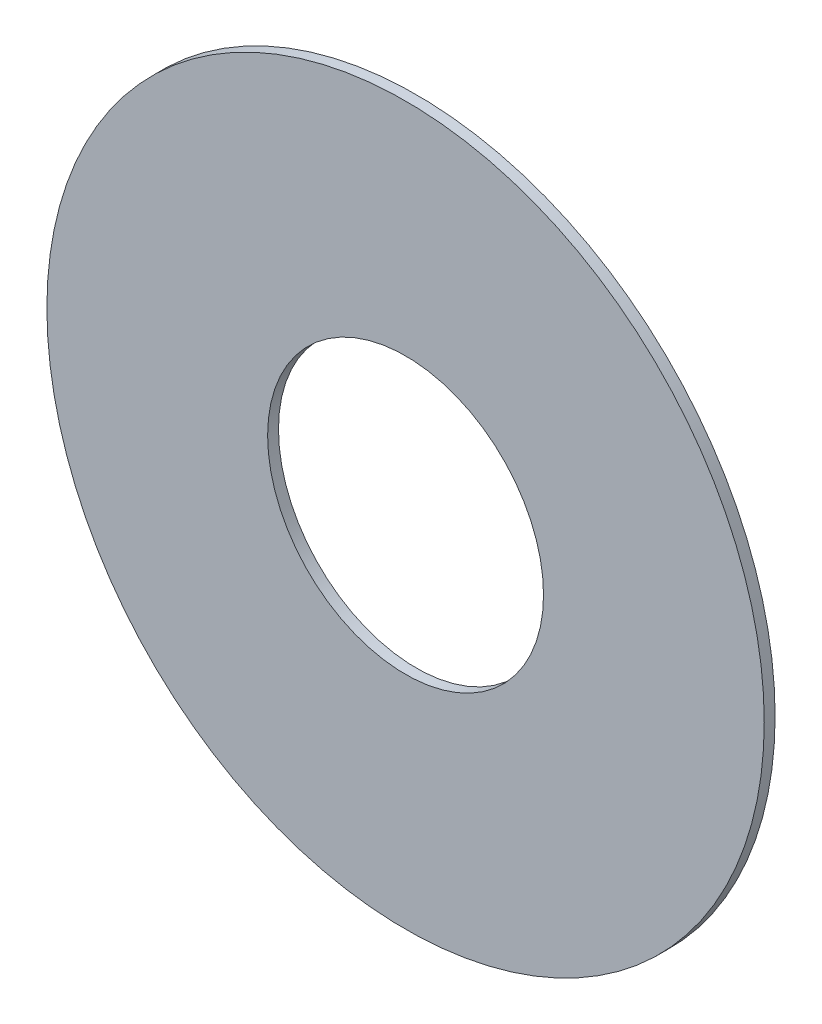
ISO-10303-21;
HEADER;
FILE_DESCRIPTION(('STEP AP214'),'2;1');
FILE_NAME('part.step','',(''),(''),'','','');
FILE_SCHEMA(('AUTOMOTIVE_DESIGN { 1 0 10303 214 1 1 1 1 }'));
ENDSEC;
DATA;
#1=APPLICATION_CONTEXT('core data for automotive mechanical design processes');
#2=APPLICATION_PROTOCOL_DEFINITION('international standard','automotive_design',2000,#1);
#3=PRODUCT_CONTEXT('',#1,'mechanical');
#4=PRODUCT('Part','Part','',(#3));
#5=PRODUCT_RELATED_PRODUCT_CATEGORY('part','',(#4));
#6=PRODUCT_DEFINITION_FORMATION('','',#4);
#7=PRODUCT_DEFINITION_CONTEXT('part definition',#1,'design');
#8=PRODUCT_DEFINITION('design','',#6,#7);
#9=PRODUCT_DEFINITION_SHAPE('','',#8);
#10=(LENGTH_UNIT() NAMED_UNIT(*) SI_UNIT(.MILLI.,.METRE.));
#11=(NAMED_UNIT(*) PLANE_ANGLE_UNIT() SI_UNIT($,.RADIAN.));
#12=(NAMED_UNIT(*) SI_UNIT($,.STERADIAN.) SOLID_ANGLE_UNIT());
#13=UNCERTAINTY_MEASURE_WITH_UNIT(LENGTH_MEASURE(1.E-05),#10,'distance_accuracy_value','');
#14=(GEOMETRIC_REPRESENTATION_CONTEXT(3) GLOBAL_UNCERTAINTY_ASSIGNED_CONTEXT((#13)) GLOBAL_UNIT_ASSIGNED_CONTEXT((#10,
#11,#12)) REPRESENTATION_CONTEXT('',''));
#15=CARTESIAN_POINT('',(0.,0.,0.));
#16=DIRECTION('',(0.,0.,1.));
#17=DIRECTION('',(1.,0.,0.));
#18=AXIS2_PLACEMENT_3D('',#15,#16,#17);
#19=CARTESIAN_POINT('',(0.,0.,5.));
#20=DIRECTION('',(0.,0.,1.));
#21=DIRECTION('',(1.,0.,0.));
#22=AXIS2_PLACEMENT_3D('',#19,#20,#21);
#23=PLANE('',#22);
#24=CARTESIAN_POINT('',(0.,0.,5.));
#25=DIRECTION('',(0.,0.,1.));
#26=DIRECTION('',(1.,0.,0.));
#27=AXIS2_PLACEMENT_3D('',#24,#25,#26);
#28=CIRCLE('',#27,165.1);
#29=CARTESIAN_POINT('',(165.1,0.,5.));
#30=VERTEX_POINT('',#29);
#31=EDGE_CURVE('E10',#30,#30,#28,.T.);
#32=ORIENTED_EDGE('',*,*,#31,.T.);
#33=EDGE_LOOP('',(#32));
#34=FACE_BOUND('',#33,.T.);
#35=CARTESIAN_POINT('',(0.,0.,5.));
#36=DIRECTION('',(0.,0.,1.));
#37=DIRECTION('',(1.,0.,0.));
#38=AXIS2_PLACEMENT_3D('',#35,#36,#37);
#39=CIRCLE('',#38,63.5);
#40=CARTESIAN_POINT('',(63.5,0.,5.));
#41=VERTEX_POINT('',#40);
#42=EDGE_CURVE('E42',#41,#41,#39,.T.);
#43=ORIENTED_EDGE('',*,*,#42,.F.);
#44=EDGE_LOOP('',(#43));
#45=FACE_BOUND('',#44,.T.);
#46=ADVANCED_FACE('F31',(#34,#45),#23,.T.);
#47=CARTESIAN_POINT('',(0.,0.,0.));
#48=DIRECTION('',(0.,0.,1.));
#49=DIRECTION('',(1.,0.,0.));
#50=AXIS2_PLACEMENT_3D('',#47,#48,#49);
#51=PLANE('',#50);
#52=CARTESIAN_POINT('',(0.,0.,0.));
#53=DIRECTION('',(0.,0.,1.));
#54=DIRECTION('',(1.,0.,0.));
#55=AXIS2_PLACEMENT_3D('',#52,#53,#54);
#56=CIRCLE('',#55,165.1);
#57=CARTESIAN_POINT('',(165.1,0.,0.));
#58=VERTEX_POINT('',#57);
#59=EDGE_CURVE('E35',#58,#58,#56,.T.);
#60=ORIENTED_EDGE('',*,*,#59,.F.);
#61=EDGE_LOOP('',(#60));
#62=FACE_BOUND('',#61,.T.);
#63=CARTESIAN_POINT('',(0.,0.,0.));
#64=DIRECTION('',(0.,0.,1.));
#65=DIRECTION('',(1.,0.,0.));
#66=AXIS2_PLACEMENT_3D('',#63,#64,#65);
#67=CIRCLE('',#66,63.5);
#68=CARTESIAN_POINT('',(63.5,0.,0.));
#69=VERTEX_POINT('',#68);
#70=EDGE_CURVE('E44',#69,#69,#67,.T.);
#71=ORIENTED_EDGE('',*,*,#70,.T.);
#72=EDGE_LOOP('',(#71));
#73=FACE_BOUND('',#72,.T.);
#74=ADVANCED_FACE('F54',(#62,#73),#51,.F.);
#75=CARTESIAN_POINT('',(0.,0.,5.));
#76=DIRECTION('',(0.,0.,-1.));
#77=DIRECTION('',(-1.,0.,0.));
#78=AXIS2_PLACEMENT_3D('',#75,#76,#77);
#79=CYLINDRICAL_SURFACE('',#78,165.1);
#80=ORIENTED_EDGE('',*,*,#31,.F.);
#81=EDGE_LOOP('',(#80));
#82=FACE_BOUND('',#81,.T.);
#83=ORIENTED_EDGE('',*,*,#59,.T.);
#84=EDGE_LOOP('',(#83));
#85=FACE_BOUND('',#84,.T.);
#86=ADVANCED_FACE('F33',(#82,#85),#79,.T.);
#87=CARTESIAN_POINT('',(0.,0.,5.));
#88=DIRECTION('',(0.,0.,-1.));
#89=DIRECTION('',(-1.,0.,0.));
#90=AXIS2_PLACEMENT_3D('',#87,#88,#89);
#91=CYLINDRICAL_SURFACE('',#90,63.5);
#92=ORIENTED_EDGE('',*,*,#42,.T.);
#93=EDGE_LOOP('',(#92));
#94=FACE_BOUND('',#93,.T.);
#95=ORIENTED_EDGE('',*,*,#70,.F.);
#96=EDGE_LOOP('',(#95));
#97=FACE_BOUND('',#96,.T.);
#98=ADVANCED_FACE('F50',(#94,#97),#91,.F.);
#99=CLOSED_SHELL('',(#46,#74,#86,#98));
#100=MANIFOLD_SOLID_BREP('B2',#99);
#101=ADVANCED_BREP_SHAPE_REPRESENTATION('',(#18,#100),#14);
#102=SHAPE_DEFINITION_REPRESENTATION(#9,#101);
ENDSEC;
END-ISO-10303-21;
